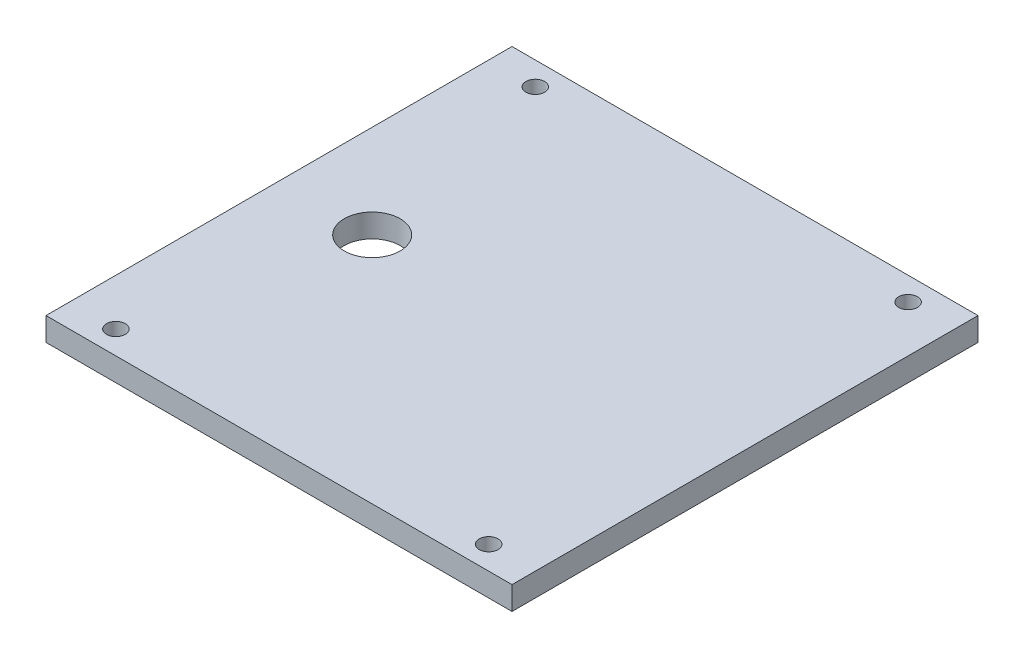
ISO-10303-21;
HEADER;
FILE_DESCRIPTION(('STEP AP214'),'2;1');
FILE_NAME('part.step','',(''),(''),'','','');
FILE_SCHEMA(('AUTOMOTIVE_DESIGN { 1 0 10303 214 1 1 1 1 }'));
ENDSEC;
DATA;
#1=APPLICATION_CONTEXT('core data for automotive mechanical design processes');
#2=APPLICATION_PROTOCOL_DEFINITION('international standard','automotive_design',2000,#1);
#3=PRODUCT_CONTEXT('',#1,'mechanical');
#4=PRODUCT('Part','Part','',(#3));
#5=PRODUCT_RELATED_PRODUCT_CATEGORY('part','',(#4));
#6=PRODUCT_DEFINITION_FORMATION('','',#4);
#7=PRODUCT_DEFINITION_CONTEXT('part definition',#1,'design');
#8=PRODUCT_DEFINITION('design','',#6,#7);
#9=PRODUCT_DEFINITION_SHAPE('','',#8);
#10=(LENGTH_UNIT() NAMED_UNIT(*) SI_UNIT(.MILLI.,.METRE.));
#11=(NAMED_UNIT(*) PLANE_ANGLE_UNIT() SI_UNIT($,.RADIAN.));
#12=(NAMED_UNIT(*) SI_UNIT($,.STERADIAN.) SOLID_ANGLE_UNIT());
#13=UNCERTAINTY_MEASURE_WITH_UNIT(LENGTH_MEASURE(1.E-05),#10,'distance_accuracy_value','');
#14=(GEOMETRIC_REPRESENTATION_CONTEXT(3) GLOBAL_UNCERTAINTY_ASSIGNED_CONTEXT((#13)) GLOBAL_UNIT_ASSIGNED_CONTEXT((#10,
#11,#12)) REPRESENTATION_CONTEXT('',''));
#15=CARTESIAN_POINT('',(0.,0.,0.));
#16=DIRECTION('',(0.,0.,1.));
#17=DIRECTION('',(1.,0.,0.));
#18=AXIS2_PLACEMENT_3D('',#15,#16,#17);
#19=CARTESIAN_POINT('',(61.6285196606894,6.35,63.5));
#20=DIRECTION('',(-1.,0.,0.));
#21=DIRECTION('',(0.,0.,1.));
#22=AXIS2_PLACEMENT_3D('',#19,#20,#21);
#23=PLANE('',#22);
#24=DIRECTION('',(0.,0.,-1.));
#25=VECTOR('',#24,1.);
#26=CARTESIAN_POINT('',(61.6285196606894,0.,63.5));
#27=LINE('',#26,#25);
#28=CARTESIAN_POINT('',(61.6285196606894,0.,63.5));
#29=VERTEX_POINT('',#28);
#30=CARTESIAN_POINT('',(61.6285196606894,0.,-63.5));
#31=VERTEX_POINT('',#30);
#32=EDGE_CURVE('E114',#29,#31,#27,.T.);
#33=ORIENTED_EDGE('',*,*,#32,.T.);
#34=DIRECTION('',(0.,-1.,0.));
#35=VECTOR('',#34,1.);
#36=CARTESIAN_POINT('',(61.6285196606894,6.35,-63.5));
#37=LINE('',#36,#35);
#38=CARTESIAN_POINT('',(61.6285196606894,6.35,-63.5));
#39=VERTEX_POINT('',#38);
#40=EDGE_CURVE('E11',#39,#31,#37,.T.);
#41=ORIENTED_EDGE('',*,*,#40,.F.);
#42=DIRECTION('',(0.,0.,-1.));
#43=VECTOR('',#42,1.);
#44=CARTESIAN_POINT('',(61.6285196606894,6.35,63.5));
#45=LINE('',#44,#43);
#46=CARTESIAN_POINT('',(61.6285196606894,6.35,63.5));
#47=VERTEX_POINT('',#46);
#48=EDGE_CURVE('E97',#47,#39,#45,.T.);
#49=ORIENTED_EDGE('',*,*,#48,.F.);
#50=DIRECTION('',(0.,-1.,0.));
#51=VECTOR('',#50,1.);
#52=CARTESIAN_POINT('',(61.6285196606894,6.35,63.5));
#53=LINE('',#52,#51);
#54=EDGE_CURVE('E110',#47,#29,#53,.T.);
#55=ORIENTED_EDGE('',*,*,#54,.T.);
#56=EDGE_LOOP('',(#33,#41,#49,#55));
#57=FACE_BOUND('',#56,.T.);
#58=ADVANCED_FACE('F43',(#57),#23,.F.);
#59=CARTESIAN_POINT('',(-65.3714803393106,6.35,-63.5));
#60=DIRECTION('',(0.,0.,1.));
#61=DIRECTION('',(1.,0.,0.));
#62=AXIS2_PLACEMENT_3D('',#59,#60,#61);
#63=PLANE('',#62);
#64=DIRECTION('',(-1.,0.,0.));
#65=VECTOR('',#64,1.);
#66=CARTESIAN_POINT('',(-65.3714803393106,0.,-63.5));
#67=LINE('',#66,#65);
#68=CARTESIAN_POINT('',(-65.3714803393106,0.,-63.5));
#69=VERTEX_POINT('',#68);
#70=EDGE_CURVE('E102',#31,#69,#67,.T.);
#71=ORIENTED_EDGE('',*,*,#70,.T.);
#72=DIRECTION('',(0.,-1.,0.));
#73=VECTOR('',#72,1.);
#74=CARTESIAN_POINT('',(-65.3714803393106,6.35,-63.5));
#75=LINE('',#74,#73);
#76=CARTESIAN_POINT('',(-65.3714803393106,6.35,-63.5));
#77=VERTEX_POINT('',#76);
#78=EDGE_CURVE('E53',#77,#69,#75,.T.);
#79=ORIENTED_EDGE('',*,*,#78,.F.);
#80=DIRECTION('',(-1.,0.,0.));
#81=VECTOR('',#80,1.);
#82=CARTESIAN_POINT('',(-65.3714803393106,6.35,-63.5));
#83=LINE('',#82,#81);
#84=EDGE_CURVE('E92',#39,#77,#83,.T.);
#85=ORIENTED_EDGE('',*,*,#84,.F.);
#86=ORIENTED_EDGE('',*,*,#40,.T.);
#87=EDGE_LOOP('',(#71,#79,#85,#86));
#88=FACE_BOUND('',#87,.T.);
#89=ADVANCED_FACE('F101',(#88),#63,.F.);
#90=CARTESIAN_POINT('',(-65.3714803393106,6.35,63.5));
#91=DIRECTION('',(1.,0.,0.));
#92=DIRECTION('',(0.,0.,-1.));
#93=AXIS2_PLACEMENT_3D('',#90,#91,#92);
#94=PLANE('',#93);
#95=DIRECTION('',(0.,0.,1.));
#96=VECTOR('',#95,1.);
#97=CARTESIAN_POINT('',(-65.3714803393106,0.,63.5));
#98=LINE('',#97,#96);
#99=CARTESIAN_POINT('',(-65.3714803393106,0.,63.5));
#100=VERTEX_POINT('',#99);
#101=EDGE_CURVE('E79',#69,#100,#98,.T.);
#102=ORIENTED_EDGE('',*,*,#101,.T.);
#103=DIRECTION('',(0.,-1.,0.));
#104=VECTOR('',#103,1.);
#105=CARTESIAN_POINT('',(-65.3714803393106,6.35,63.5));
#106=LINE('',#105,#104);
#107=CARTESIAN_POINT('',(-65.3714803393106,6.35,63.5));
#108=VERTEX_POINT('',#107);
#109=EDGE_CURVE('E104',#108,#100,#106,.T.);
#110=ORIENTED_EDGE('',*,*,#109,.F.);
#111=DIRECTION('',(0.,0.,1.));
#112=VECTOR('',#111,1.);
#113=CARTESIAN_POINT('',(-65.3714803393106,6.35,63.5));
#114=LINE('',#113,#112);
#115=EDGE_CURVE('E95',#77,#108,#114,.T.);
#116=ORIENTED_EDGE('',*,*,#115,.F.);
#117=ORIENTED_EDGE('',*,*,#78,.T.);
#118=EDGE_LOOP('',(#102,#110,#116,#117));
#119=FACE_BOUND('',#118,.T.);
#120=ADVANCED_FACE('F106',(#119),#94,.F.);
#121=CARTESIAN_POINT('',(-65.3714803393106,6.35,63.5));
#122=DIRECTION('',(0.,0.,-1.));
#123=DIRECTION('',(-1.,0.,0.));
#124=AXIS2_PLACEMENT_3D('',#121,#122,#123);
#125=PLANE('',#124);
#126=DIRECTION('',(1.,0.,0.));
#127=VECTOR('',#126,1.);
#128=CARTESIAN_POINT('',(-65.3714803393106,0.,63.5));
#129=LINE('',#128,#127);
#130=EDGE_CURVE('E85',#100,#29,#129,.T.);
#131=ORIENTED_EDGE('',*,*,#130,.T.);
#132=ORIENTED_EDGE('',*,*,#54,.F.);
#133=DIRECTION('',(1.,0.,0.));
#134=VECTOR('',#133,1.);
#135=CARTESIAN_POINT('',(-65.3714803393106,6.35,63.5));
#136=LINE('',#135,#134);
#137=EDGE_CURVE('E62',#108,#47,#136,.T.);
#138=ORIENTED_EDGE('',*,*,#137,.F.);
#139=ORIENTED_EDGE('',*,*,#109,.T.);
#140=EDGE_LOOP('',(#131,#132,#138,#139));
#141=FACE_BOUND('',#140,.T.);
#142=ADVANCED_FACE('F161',(#141),#125,.F.);
#143=CARTESIAN_POINT('',(0.,6.35,0.));
#144=DIRECTION('',(0.,-1.,0.));
#145=DIRECTION('',(0.,0.,-1.));
#146=AXIS2_PLACEMENT_3D('',#143,#144,#145);
#147=PLANE('',#146);
#148=CARTESIAN_POINT('',(-39.9714803393106,6.35,0.));
#149=DIRECTION('',(0.,1.,0.));
#150=DIRECTION('',(0.,0.,1.));
#151=AXIS2_PLACEMENT_3D('',#148,#149,#150);
#152=CIRCLE('',#151,7.62);
#153=CARTESIAN_POINT('',(-39.9714803393106,6.35,7.62000000000002));
#154=VERTEX_POINT('',#153);
#155=EDGE_CURVE('E281',#154,#154,#152,.T.);
#156=ORIENTED_EDGE('',*,*,#155,.F.);
#157=EDGE_LOOP('',(#156));
#158=FACE_BOUND('',#157,.T.);
#159=CARTESIAN_POINT('',(48.9285196606894,6.35,-57.15));
#160=DIRECTION('',(0.,1.,0.));
#161=DIRECTION('',(0.,0.,-1.));
#162=AXIS2_PLACEMENT_3D('',#159,#160,#161);
#163=CIRCLE('',#162,2.5527);
#164=CARTESIAN_POINT('',(48.9285196606894,6.35,-54.5973));
#165=VERTEX_POINT('',#164);
#166=EDGE_CURVE('E283',#165,#165,#163,.T.);
#167=ORIENTED_EDGE('',*,*,#166,.F.);
#168=EDGE_LOOP('',(#167));
#169=FACE_BOUND('',#168,.T.);
#170=CARTESIAN_POINT('',(48.9285196606894,6.35,57.15));
#171=DIRECTION('',(0.,1.,0.));
#172=DIRECTION('',(0.,0.,1.));
#173=AXIS2_PLACEMENT_3D('',#170,#171,#172);
#174=CIRCLE('',#173,2.5527);
#175=CARTESIAN_POINT('',(48.9285196606894,6.35,59.7027));
#176=VERTEX_POINT('',#175);
#177=EDGE_CURVE('E288',#176,#176,#174,.T.);
#178=ORIENTED_EDGE('',*,*,#177,.F.);
#179=EDGE_LOOP('',(#178));
#180=FACE_BOUND('',#179,.T.);
#181=CARTESIAN_POINT('',(-52.6714803393106,6.35,57.15));
#182=DIRECTION('',(0.,1.,0.));
#183=DIRECTION('',(0.,0.,-1.));
#184=AXIS2_PLACEMENT_3D('',#181,#182,#183);
#185=CIRCLE('',#184,2.5527);
#186=CARTESIAN_POINT('',(-52.6714803393106,6.35,59.7027));
#187=VERTEX_POINT('',#186);
#188=EDGE_CURVE('E292',#187,#187,#185,.T.);
#189=ORIENTED_EDGE('',*,*,#188,.F.);
#190=EDGE_LOOP('',(#189));
#191=FACE_BOUND('',#190,.T.);
#192=CARTESIAN_POINT('',(-52.6714803393106,6.35,-57.15));
#193=DIRECTION('',(0.,1.,0.));
#194=DIRECTION('',(0.,0.,1.));
#195=AXIS2_PLACEMENT_3D('',#192,#193,#194);
#196=CIRCLE('',#195,2.5527);
#197=CARTESIAN_POINT('',(-52.6714803393106,6.35,-54.5973));
#198=VERTEX_POINT('',#197);
#199=EDGE_CURVE('E133',#198,#198,#196,.T.);
#200=ORIENTED_EDGE('',*,*,#199,.F.);
#201=EDGE_LOOP('',(#200));
#202=FACE_BOUND('',#201,.T.);
#203=ORIENTED_EDGE('',*,*,#48,.T.);
#204=ORIENTED_EDGE('',*,*,#84,.T.);
#205=ORIENTED_EDGE('',*,*,#115,.T.);
#206=ORIENTED_EDGE('',*,*,#137,.T.);
#207=EDGE_LOOP('',(#203,#204,#205,#206));
#208=FACE_BOUND('',#207,.T.);
#209=ADVANCED_FACE('F93',(#158,#169,#180,#191,#202,#208),#147,.F.);
#210=CARTESIAN_POINT('',(0.,0.,0.));
#211=DIRECTION('',(0.,-1.,0.));
#212=DIRECTION('',(0.,0.,-1.));
#213=AXIS2_PLACEMENT_3D('',#210,#211,#212);
#214=PLANE('',#213);
#215=CARTESIAN_POINT('',(-39.9714803393106,0.,0.));
#216=DIRECTION('',(0.,-1.,0.));
#217=DIRECTION('',(0.,0.,-1.));
#218=AXIS2_PLACEMENT_3D('',#215,#216,#217);
#219=CIRCLE('',#218,7.62);
#220=CARTESIAN_POINT('',(-39.9714803393106,0.,-7.61999999999999));
#221=VERTEX_POINT('',#220);
#222=EDGE_CURVE('E278',#221,#221,#219,.F.);
#223=ORIENTED_EDGE('',*,*,#222,.T.);
#224=EDGE_LOOP('',(#223));
#225=FACE_BOUND('',#224,.T.);
#226=CARTESIAN_POINT('',(48.9285196606894,0.,-57.15));
#227=DIRECTION('',(0.,-1.,0.));
#228=DIRECTION('',(0.,0.,-1.));
#229=AXIS2_PLACEMENT_3D('',#226,#227,#228);
#230=CIRCLE('',#229,2.5527);
#231=CARTESIAN_POINT('',(48.9285196606894,0.,-54.5973));
#232=VERTEX_POINT('',#231);
#233=EDGE_CURVE('E46',#232,#232,#230,.T.);
#234=ORIENTED_EDGE('',*,*,#233,.F.);
#235=EDGE_LOOP('',(#234));
#236=FACE_BOUND('',#235,.T.);
#237=CARTESIAN_POINT('',(48.9285196606894,0.,57.15));
#238=DIRECTION('',(0.,-1.,0.));
#239=DIRECTION('',(0.,0.,-1.));
#240=AXIS2_PLACEMENT_3D('',#237,#238,#239);
#241=CIRCLE('',#240,2.5527);
#242=CARTESIAN_POINT('',(48.9285196606894,0.,59.7027));
#243=VERTEX_POINT('',#242);
#244=EDGE_CURVE('E136',#243,#243,#241,.T.);
#245=ORIENTED_EDGE('',*,*,#244,.F.);
#246=EDGE_LOOP('',(#245));
#247=FACE_BOUND('',#246,.T.);
#248=CARTESIAN_POINT('',(-52.6714803393106,0.,57.15));
#249=DIRECTION('',(0.,-1.,0.));
#250=DIRECTION('',(0.,0.,-1.));
#251=AXIS2_PLACEMENT_3D('',#248,#249,#250);
#252=CIRCLE('',#251,2.5527);
#253=CARTESIAN_POINT('',(-52.6714803393106,0.,59.7027));
#254=VERTEX_POINT('',#253);
#255=EDGE_CURVE('E132',#254,#254,#252,.T.);
#256=ORIENTED_EDGE('',*,*,#255,.F.);
#257=EDGE_LOOP('',(#256));
#258=FACE_BOUND('',#257,.T.);
#259=CARTESIAN_POINT('',(-52.6714803393106,0.,-57.15));
#260=DIRECTION('',(0.,-1.,0.));
#261=DIRECTION('',(0.,0.,-1.));
#262=AXIS2_PLACEMENT_3D('',#259,#260,#261);
#263=CIRCLE('',#262,2.5527);
#264=CARTESIAN_POINT('',(-52.6714803393106,0.,-54.5973));
#265=VERTEX_POINT('',#264);
#266=EDGE_CURVE('E128',#265,#265,#263,.T.);
#267=ORIENTED_EDGE('',*,*,#266,.F.);
#268=EDGE_LOOP('',(#267));
#269=FACE_BOUND('',#268,.T.);
#270=ORIENTED_EDGE('',*,*,#32,.F.);
#271=ORIENTED_EDGE('',*,*,#130,.F.);
#272=ORIENTED_EDGE('',*,*,#101,.F.);
#273=ORIENTED_EDGE('',*,*,#70,.F.);
#274=EDGE_LOOP('',(#270,#271,#272,#273));
#275=FACE_BOUND('',#274,.T.);
#276=ADVANCED_FACE('F148',(#225,#236,#247,#258,#269,#275),#214,.T.);
#277=CARTESIAN_POINT('',(-52.6714803393106,-3.175,-57.15));
#278=DIRECTION('',(0.,1.,0.));
#279=DIRECTION('',(0.,0.,1.));
#280=AXIS2_PLACEMENT_3D('',#277,#278,#279);
#281=CYLINDRICAL_SURFACE('',#280,2.5527);
#282=CARTESIAN_POINT('',(-52.6714803393106,0.,-54.5973));
#283=CARTESIAN_POINT('',(-52.6714803393106,0.0661458333333336,-54.5973));
#284=CARTESIAN_POINT('',(-52.6714803393106,0.132291666666667,-54.5973));
#285=CARTESIAN_POINT('',(-52.6714803393106,0.264583333333334,-54.5973));
#286=CARTESIAN_POINT('',(-52.6714803393106,0.330729166666667,-54.5973));
#287=CARTESIAN_POINT('',(-52.6714803393106,0.463020833333334,-54.5973));
#288=CARTESIAN_POINT('',(-52.6714803393106,0.529166666666667,-54.5973));
#289=CARTESIAN_POINT('',(-52.6714803393106,0.661458333333334,-54.5973));
#290=CARTESIAN_POINT('',(-52.6714803393106,0.727604166666667,-54.5973));
#291=CARTESIAN_POINT('',(-52.6714803393106,0.859895833333333,-54.5973));
#292=CARTESIAN_POINT('',(-52.6714803393106,0.926041666666667,-54.5973));
#293=CARTESIAN_POINT('',(-52.6714803393106,1.05833333333333,-54.5973));
#294=CARTESIAN_POINT('',(-52.6714803393106,1.12447916666667,-54.5973));
#295=CARTESIAN_POINT('',(-52.6714803393106,1.25677083333333,-54.5973));
#296=CARTESIAN_POINT('',(-52.6714803393106,1.32291666666667,-54.5973));
#297=CARTESIAN_POINT('',(-52.6714803393106,1.45520833333333,-54.5973));
#298=CARTESIAN_POINT('',(-52.6714803393106,1.52135416666667,-54.5973));
#299=CARTESIAN_POINT('',(-52.6714803393106,1.65364583333333,-54.5973));
#300=CARTESIAN_POINT('',(-52.6714803393106,1.71979166666667,-54.5973));
#301=CARTESIAN_POINT('',(-52.6714803393106,1.85208333333333,-54.5973));
#302=CARTESIAN_POINT('',(-52.6714803393106,1.91822916666667,-54.5973));
#303=CARTESIAN_POINT('',(-52.6714803393106,2.05052083333333,-54.5973));
#304=CARTESIAN_POINT('',(-52.6714803393106,2.11666666666667,-54.5973));
#305=CARTESIAN_POINT('',(-52.6714803393106,2.24895833333333,-54.5973));
#306=CARTESIAN_POINT('',(-52.6714803393106,2.31510416666667,-54.5973));
#307=CARTESIAN_POINT('',(-52.6714803393106,2.44739583333333,-54.5973));
#308=CARTESIAN_POINT('',(-52.6714803393106,2.51354166666667,-54.5973));
#309=CARTESIAN_POINT('',(-52.6714803393106,2.64583333333333,-54.5973));
#310=CARTESIAN_POINT('',(-52.6714803393106,2.71197916666667,-54.5973));
#311=CARTESIAN_POINT('',(-52.6714803393106,2.84427083333333,-54.5973));
#312=CARTESIAN_POINT('',(-52.6714803393106,2.91041666666667,-54.5973));
#313=CARTESIAN_POINT('',(-52.6714803393106,3.04270833333333,-54.5973));
#314=CARTESIAN_POINT('',(-52.6714803393106,3.10885416666667,-54.5973));
#315=CARTESIAN_POINT('',(-52.6714803393106,3.24114583333333,-54.5973));
#316=CARTESIAN_POINT('',(-52.6714803393106,3.30729166666667,-54.5973));
#317=CARTESIAN_POINT('',(-52.6714803393106,3.43958333333333,-54.5973));
#318=CARTESIAN_POINT('',(-52.6714803393106,3.50572916666667,-54.5973));
#319=CARTESIAN_POINT('',(-52.6714803393106,3.63802083333333,-54.5973));
#320=CARTESIAN_POINT('',(-52.6714803393106,3.70416666666667,-54.5973));
#321=CARTESIAN_POINT('',(-52.6714803393106,3.83645833333333,-54.5973));
#322=CARTESIAN_POINT('',(-52.6714803393106,3.90260416666667,-54.5973));
#323=CARTESIAN_POINT('',(-52.6714803393106,4.03489583333333,-54.5973));
#324=CARTESIAN_POINT('',(-52.6714803393106,4.10104166666667,-54.5973));
#325=CARTESIAN_POINT('',(-52.6714803393106,4.23333333333333,-54.5973));
#326=CARTESIAN_POINT('',(-52.6714803393106,4.29947916666667,-54.5973));
#327=CARTESIAN_POINT('',(-52.6714803393106,4.43177083333333,-54.5973));
#328=CARTESIAN_POINT('',(-52.6714803393106,4.49791666666667,-54.5973));
#329=CARTESIAN_POINT('',(-52.6714803393106,4.63020833333333,-54.5973));
#330=CARTESIAN_POINT('',(-52.6714803393106,4.69635416666667,-54.5973));
#331=CARTESIAN_POINT('',(-52.6714803393106,4.82864583333333,-54.5973));
#332=CARTESIAN_POINT('',(-52.6714803393106,4.89479166666667,-54.5973));
#333=CARTESIAN_POINT('',(-52.6714803393106,5.02708333333333,-54.5973));
#334=CARTESIAN_POINT('',(-52.6714803393106,5.09322916666667,-54.5973));
#335=CARTESIAN_POINT('',(-52.6714803393106,5.22552083333333,-54.5973));
#336=CARTESIAN_POINT('',(-52.6714803393106,5.29166666666667,-54.5973));
#337=CARTESIAN_POINT('',(-52.6714803393106,5.42395833333333,-54.5973));
#338=CARTESIAN_POINT('',(-52.6714803393106,5.49010416666667,-54.5973));
#339=CARTESIAN_POINT('',(-52.6714803393106,5.62239583333333,-54.5973));
#340=CARTESIAN_POINT('',(-52.6714803393106,5.68854166666667,-54.5973));
#341=CARTESIAN_POINT('',(-52.6714803393106,5.82083333333333,-54.5973));
#342=CARTESIAN_POINT('',(-52.6714803393106,5.88697916666667,-54.5973));
#343=CARTESIAN_POINT('',(-52.6714803393106,6.01927083333333,-54.5973));
#344=CARTESIAN_POINT('',(-52.6714803393106,6.08541666666667,-54.5973));
#345=CARTESIAN_POINT('',(-52.6714803393106,6.21770833333333,-54.5973));
#346=CARTESIAN_POINT('',(-52.6714803393106,6.28385416666667,-54.5973));
#347=CARTESIAN_POINT('',(-52.6714803393106,6.35,-54.5973));
#348=B_SPLINE_CURVE_WITH_KNOTS('',3,(#282,#283,#284,#285,#286,#287,#288,#289,#290,#291,#292,
#293,#294,#295,#296,#297,#298,#299,#300,#301,#302,#303,#304,#305,#306,#307,#308,#309,#310,#311,
#312,#313,#314,#315,#316,#317,#318,#319,#320,#321,#322,#323,#324,#325,#326,#327,#328,#329,#330,
#331,#332,#333,#334,#335,#336,#337,#338,#339,#340,#341,#342,#343,#344,#345,#346,#347),
.UNSPECIFIED.,.F.,.F.,(4,2,2,2,2,2,2,2,2,2,2,2,2,2,2,2,2,2,2,2,2,2,2,2,2,2,2,2,2,2,2,2,4),(0.,
0.1984375,0.396875,0.5953125,0.79375,0.9921875,1.190625,1.3890625,1.5875,1.7859375,1.984375,
2.1828125,2.38125,2.5796875,2.778125,2.9765625,3.175,3.3734375,3.571875,3.7703125,3.96875,
4.1671875,4.365625,4.5640625,4.7625,4.9609375,5.159375,5.3578125,5.55625,5.7546875,5.953125,
6.1515625,6.35),.UNSPECIFIED.);
#349=EDGE_CURVE('BSEAM151',#265,#198,#348,.T.);
#350=ORIENTED_EDGE('',*,*,#266,.T.);
#351=ORIENTED_EDGE('',*,*,#199,.T.);
#352=ORIENTED_EDGE('',*,*,#349,.T.);
#353=ORIENTED_EDGE('',*,*,#349,.F.);
#354=EDGE_LOOP('',(#350,#352,#351,#353));
#355=FACE_BOUND('',#354,.T.);
#356=ADVANCED_FACE('F151',(#355),#281,.F.);
#357=CARTESIAN_POINT('',(-52.6714803393106,-3.175,57.15));
#358=DIRECTION('',(0.,1.,0.));
#359=DIRECTION('',(0.,0.,1.));
#360=AXIS2_PLACEMENT_3D('',#357,#358,#359);
#361=CYLINDRICAL_SURFACE('',#360,2.5527);
#362=CARTESIAN_POINT('',(-52.6714803393106,0.,59.7027));
#363=CARTESIAN_POINT('',(-52.6714803393106,0.0661458333333336,59.7027));
#364=CARTESIAN_POINT('',(-52.6714803393106,0.132291666666667,59.7027));
#365=CARTESIAN_POINT('',(-52.6714803393106,0.264583333333334,59.7027));
#366=CARTESIAN_POINT('',(-52.6714803393106,0.330729166666667,59.7027));
#367=CARTESIAN_POINT('',(-52.6714803393106,0.463020833333334,59.7027));
#368=CARTESIAN_POINT('',(-52.6714803393106,0.529166666666667,59.7027));
#369=CARTESIAN_POINT('',(-52.6714803393106,0.661458333333334,59.7027));
#370=CARTESIAN_POINT('',(-52.6714803393106,0.727604166666667,59.7027));
#371=CARTESIAN_POINT('',(-52.6714803393106,0.859895833333333,59.7027));
#372=CARTESIAN_POINT('',(-52.6714803393106,0.926041666666667,59.7027));
#373=CARTESIAN_POINT('',(-52.6714803393106,1.05833333333333,59.7027));
#374=CARTESIAN_POINT('',(-52.6714803393106,1.12447916666667,59.7027));
#375=CARTESIAN_POINT('',(-52.6714803393106,1.25677083333333,59.7027));
#376=CARTESIAN_POINT('',(-52.6714803393106,1.32291666666667,59.7027));
#377=CARTESIAN_POINT('',(-52.6714803393106,1.45520833333333,59.7027));
#378=CARTESIAN_POINT('',(-52.6714803393106,1.52135416666667,59.7027));
#379=CARTESIAN_POINT('',(-52.6714803393106,1.65364583333333,59.7027));
#380=CARTESIAN_POINT('',(-52.6714803393106,1.71979166666667,59.7027));
#381=CARTESIAN_POINT('',(-52.6714803393106,1.85208333333333,59.7027));
#382=CARTESIAN_POINT('',(-52.6714803393106,1.91822916666667,59.7027));
#383=CARTESIAN_POINT('',(-52.6714803393106,2.05052083333333,59.7027));
#384=CARTESIAN_POINT('',(-52.6714803393106,2.11666666666667,59.7027));
#385=CARTESIAN_POINT('',(-52.6714803393106,2.24895833333333,59.7027));
#386=CARTESIAN_POINT('',(-52.6714803393106,2.31510416666667,59.7027));
#387=CARTESIAN_POINT('',(-52.6714803393106,2.44739583333333,59.7027));
#388=CARTESIAN_POINT('',(-52.6714803393106,2.51354166666667,59.7027));
#389=CARTESIAN_POINT('',(-52.6714803393106,2.64583333333333,59.7027));
#390=CARTESIAN_POINT('',(-52.6714803393106,2.71197916666667,59.7027));
#391=CARTESIAN_POINT('',(-52.6714803393106,2.84427083333333,59.7027));
#392=CARTESIAN_POINT('',(-52.6714803393106,2.91041666666667,59.7027));
#393=CARTESIAN_POINT('',(-52.6714803393106,3.04270833333333,59.7027));
#394=CARTESIAN_POINT('',(-52.6714803393106,3.10885416666667,59.7027));
#395=CARTESIAN_POINT('',(-52.6714803393106,3.24114583333333,59.7027));
#396=CARTESIAN_POINT('',(-52.6714803393106,3.30729166666667,59.7027));
#397=CARTESIAN_POINT('',(-52.6714803393106,3.43958333333333,59.7027));
#398=CARTESIAN_POINT('',(-52.6714803393106,3.50572916666667,59.7027));
#399=CARTESIAN_POINT('',(-52.6714803393106,3.63802083333333,59.7027));
#400=CARTESIAN_POINT('',(-52.6714803393106,3.70416666666667,59.7027));
#401=CARTESIAN_POINT('',(-52.6714803393106,3.83645833333333,59.7027));
#402=CARTESIAN_POINT('',(-52.6714803393106,3.90260416666667,59.7027));
#403=CARTESIAN_POINT('',(-52.6714803393106,4.03489583333333,59.7027));
#404=CARTESIAN_POINT('',(-52.6714803393106,4.10104166666667,59.7027));
#405=CARTESIAN_POINT('',(-52.6714803393106,4.23333333333333,59.7027));
#406=CARTESIAN_POINT('',(-52.6714803393106,4.29947916666667,59.7027));
#407=CARTESIAN_POINT('',(-52.6714803393106,4.43177083333333,59.7027));
#408=CARTESIAN_POINT('',(-52.6714803393106,4.49791666666667,59.7027));
#409=CARTESIAN_POINT('',(-52.6714803393106,4.63020833333333,59.7027));
#410=CARTESIAN_POINT('',(-52.6714803393106,4.69635416666667,59.7027));
#411=CARTESIAN_POINT('',(-52.6714803393106,4.82864583333333,59.7027));
#412=CARTESIAN_POINT('',(-52.6714803393106,4.89479166666667,59.7027));
#413=CARTESIAN_POINT('',(-52.6714803393106,5.02708333333333,59.7027));
#414=CARTESIAN_POINT('',(-52.6714803393106,5.09322916666667,59.7027));
#415=CARTESIAN_POINT('',(-52.6714803393106,5.22552083333333,59.7027));
#416=CARTESIAN_POINT('',(-52.6714803393106,5.29166666666667,59.7027));
#417=CARTESIAN_POINT('',(-52.6714803393106,5.42395833333333,59.7027));
#418=CARTESIAN_POINT('',(-52.6714803393106,5.49010416666667,59.7027));
#419=CARTESIAN_POINT('',(-52.6714803393106,5.62239583333333,59.7027));
#420=CARTESIAN_POINT('',(-52.6714803393106,5.68854166666667,59.7027));
#421=CARTESIAN_POINT('',(-52.6714803393106,5.82083333333333,59.7027));
#422=CARTESIAN_POINT('',(-52.6714803393106,5.88697916666667,59.7027));
#423=CARTESIAN_POINT('',(-52.6714803393106,6.01927083333333,59.7027));
#424=CARTESIAN_POINT('',(-52.6714803393106,6.08541666666667,59.7027));
#425=CARTESIAN_POINT('',(-52.6714803393106,6.21770833333333,59.7027));
#426=CARTESIAN_POINT('',(-52.6714803393106,6.28385416666667,59.7027));
#427=CARTESIAN_POINT('',(-52.6714803393106,6.35,59.7027));
#428=B_SPLINE_CURVE_WITH_KNOTS('',3,(#362,#363,#364,#365,#366,#367,#368,#369,#370,#371,#372,
#373,#374,#375,#376,#377,#378,#379,#380,#381,#382,#383,#384,#385,#386,#387,#388,#389,#390,#391,
#392,#393,#394,#395,#396,#397,#398,#399,#400,#401,#402,#403,#404,#405,#406,#407,#408,#409,#410,
#411,#412,#413,#414,#415,#416,#417,#418,#419,#420,#421,#422,#423,#424,#425,#426,#427),
.UNSPECIFIED.,.F.,.F.,(4,2,2,2,2,2,2,2,2,2,2,2,2,2,2,2,2,2,2,2,2,2,2,2,2,2,2,2,2,2,2,2,4),(0.,
0.1984375,0.396875,0.5953125,0.79375,0.9921875,1.190625,1.3890625,1.5875,1.7859375,1.984375,
2.1828125,2.38125,2.5796875,2.778125,2.9765625,3.175,3.3734375,3.571875,3.7703125,3.96875,
4.1671875,4.365625,4.5640625,4.7625,4.9609375,5.159375,5.3578125,5.55625,5.7546875,5.953125,
6.1515625,6.35),.UNSPECIFIED.);
#429=EDGE_CURVE('BSEAM197',#254,#187,#428,.T.);
#430=ORIENTED_EDGE('',*,*,#255,.T.);
#431=ORIENTED_EDGE('',*,*,#188,.T.);
#432=ORIENTED_EDGE('',*,*,#429,.T.);
#433=ORIENTED_EDGE('',*,*,#429,.F.);
#434=EDGE_LOOP('',(#430,#432,#431,#433));
#435=FACE_BOUND('',#434,.T.);
#436=ADVANCED_FACE('F197',(#435),#361,.F.);
#437=CARTESIAN_POINT('',(48.9285196606894,-3.175,57.15));
#438=DIRECTION('',(0.,1.,0.));
#439=DIRECTION('',(0.,0.,1.));
#440=AXIS2_PLACEMENT_3D('',#437,#438,#439);
#441=CYLINDRICAL_SURFACE('',#440,2.5527);
#442=CARTESIAN_POINT('',(48.9285196606894,0.,59.7027));
#443=CARTESIAN_POINT('',(48.9285196606894,0.0661458333333336,59.7027));
#444=CARTESIAN_POINT('',(48.9285196606894,0.132291666666667,59.7027));
#445=CARTESIAN_POINT('',(48.9285196606894,0.264583333333334,59.7027));
#446=CARTESIAN_POINT('',(48.9285196606894,0.330729166666667,59.7027));
#447=CARTESIAN_POINT('',(48.9285196606894,0.463020833333334,59.7027));
#448=CARTESIAN_POINT('',(48.9285196606894,0.529166666666667,59.7027));
#449=CARTESIAN_POINT('',(48.9285196606894,0.661458333333334,59.7027));
#450=CARTESIAN_POINT('',(48.9285196606894,0.727604166666667,59.7027));
#451=CARTESIAN_POINT('',(48.9285196606894,0.859895833333333,59.7027));
#452=CARTESIAN_POINT('',(48.9285196606894,0.926041666666667,59.7027));
#453=CARTESIAN_POINT('',(48.9285196606894,1.05833333333333,59.7027));
#454=CARTESIAN_POINT('',(48.9285196606894,1.12447916666667,59.7027));
#455=CARTESIAN_POINT('',(48.9285196606894,1.25677083333333,59.7027));
#456=CARTESIAN_POINT('',(48.9285196606894,1.32291666666667,59.7027));
#457=CARTESIAN_POINT('',(48.9285196606894,1.45520833333333,59.7027));
#458=CARTESIAN_POINT('',(48.9285196606894,1.52135416666667,59.7027));
#459=CARTESIAN_POINT('',(48.9285196606894,1.65364583333333,59.7027));
#460=CARTESIAN_POINT('',(48.9285196606894,1.71979166666667,59.7027));
#461=CARTESIAN_POINT('',(48.9285196606894,1.85208333333333,59.7027));
#462=CARTESIAN_POINT('',(48.9285196606894,1.91822916666667,59.7027));
#463=CARTESIAN_POINT('',(48.9285196606894,2.05052083333333,59.7027));
#464=CARTESIAN_POINT('',(48.9285196606894,2.11666666666667,59.7027));
#465=CARTESIAN_POINT('',(48.9285196606894,2.24895833333333,59.7027));
#466=CARTESIAN_POINT('',(48.9285196606894,2.31510416666667,59.7027));
#467=CARTESIAN_POINT('',(48.9285196606894,2.44739583333333,59.7027));
#468=CARTESIAN_POINT('',(48.9285196606894,2.51354166666667,59.7027));
#469=CARTESIAN_POINT('',(48.9285196606894,2.64583333333333,59.7027));
#470=CARTESIAN_POINT('',(48.9285196606894,2.71197916666667,59.7027));
#471=CARTESIAN_POINT('',(48.9285196606894,2.84427083333333,59.7027));
#472=CARTESIAN_POINT('',(48.9285196606894,2.91041666666667,59.7027));
#473=CARTESIAN_POINT('',(48.9285196606894,3.04270833333333,59.7027));
#474=CARTESIAN_POINT('',(48.9285196606894,3.10885416666667,59.7027));
#475=CARTESIAN_POINT('',(48.9285196606894,3.24114583333333,59.7027));
#476=CARTESIAN_POINT('',(48.9285196606894,3.30729166666667,59.7027));
#477=CARTESIAN_POINT('',(48.9285196606894,3.43958333333333,59.7027));
#478=CARTESIAN_POINT('',(48.9285196606894,3.50572916666667,59.7027));
#479=CARTESIAN_POINT('',(48.9285196606894,3.63802083333333,59.7027));
#480=CARTESIAN_POINT('',(48.9285196606894,3.70416666666667,59.7027));
#481=CARTESIAN_POINT('',(48.9285196606894,3.83645833333333,59.7027));
#482=CARTESIAN_POINT('',(48.9285196606894,3.90260416666667,59.7027));
#483=CARTESIAN_POINT('',(48.9285196606894,4.03489583333333,59.7027));
#484=CARTESIAN_POINT('',(48.9285196606894,4.10104166666667,59.7027));
#485=CARTESIAN_POINT('',(48.9285196606894,4.23333333333333,59.7027));
#486=CARTESIAN_POINT('',(48.9285196606894,4.29947916666667,59.7027));
#487=CARTESIAN_POINT('',(48.9285196606894,4.43177083333333,59.7027));
#488=CARTESIAN_POINT('',(48.9285196606894,4.49791666666667,59.7027));
#489=CARTESIAN_POINT('',(48.9285196606894,4.63020833333333,59.7027));
#490=CARTESIAN_POINT('',(48.9285196606894,4.69635416666667,59.7027));
#491=CARTESIAN_POINT('',(48.9285196606894,4.82864583333333,59.7027));
#492=CARTESIAN_POINT('',(48.9285196606894,4.89479166666667,59.7027));
#493=CARTESIAN_POINT('',(48.9285196606894,5.02708333333333,59.7027));
#494=CARTESIAN_POINT('',(48.9285196606894,5.09322916666667,59.7027));
#495=CARTESIAN_POINT('',(48.9285196606894,5.22552083333333,59.7027));
#496=CARTESIAN_POINT('',(48.9285196606894,5.29166666666667,59.7027));
#497=CARTESIAN_POINT('',(48.9285196606894,5.42395833333333,59.7027));
#498=CARTESIAN_POINT('',(48.9285196606894,5.49010416666667,59.7027));
#499=CARTESIAN_POINT('',(48.9285196606894,5.62239583333333,59.7027));
#500=CARTESIAN_POINT('',(48.9285196606894,5.68854166666667,59.7027));
#501=CARTESIAN_POINT('',(48.9285196606894,5.82083333333333,59.7027));
#502=CARTESIAN_POINT('',(48.9285196606894,5.88697916666667,59.7027));
#503=CARTESIAN_POINT('',(48.9285196606894,6.01927083333333,59.7027));
#504=CARTESIAN_POINT('',(48.9285196606894,6.08541666666667,59.7027));
#505=CARTESIAN_POINT('',(48.9285196606894,6.21770833333333,59.7027));
#506=CARTESIAN_POINT('',(48.9285196606894,6.28385416666667,59.7027));
#507=CARTESIAN_POINT('',(48.9285196606894,6.35,59.7027));
#508=B_SPLINE_CURVE_WITH_KNOTS('',3,(#442,#443,#444,#445,#446,#447,#448,#449,#450,#451,#452,
#453,#454,#455,#456,#457,#458,#459,#460,#461,#462,#463,#464,#465,#466,#467,#468,#469,#470,#471,
#472,#473,#474,#475,#476,#477,#478,#479,#480,#481,#482,#483,#484,#485,#486,#487,#488,#489,#490,
#491,#492,#493,#494,#495,#496,#497,#498,#499,#500,#501,#502,#503,#504,#505,#506,#507),
.UNSPECIFIED.,.F.,.F.,(4,2,2,2,2,2,2,2,2,2,2,2,2,2,2,2,2,2,2,2,2,2,2,2,2,2,2,2,2,2,2,2,4),(0.,
0.1984375,0.396875,0.5953125,0.79375,0.9921875,1.190625,1.3890625,1.5875,1.7859375,1.984375,
2.1828125,2.38125,2.5796875,2.778125,2.9765625,3.175,3.3734375,3.571875,3.7703125,3.96875,
4.1671875,4.365625,4.5640625,4.7625,4.9609375,5.159375,5.3578125,5.55625,5.7546875,5.953125,
6.1515625,6.35),.UNSPECIFIED.);
#509=EDGE_CURVE('BSEAM209',#243,#176,#508,.T.);
#510=ORIENTED_EDGE('',*,*,#244,.T.);
#511=ORIENTED_EDGE('',*,*,#177,.T.);
#512=ORIENTED_EDGE('',*,*,#509,.T.);
#513=ORIENTED_EDGE('',*,*,#509,.F.);
#514=EDGE_LOOP('',(#510,#512,#511,#513));
#515=FACE_BOUND('',#514,.T.);
#516=ADVANCED_FACE('F209',(#515),#441,.F.);
#517=CARTESIAN_POINT('',(48.9285196606894,-3.175,-57.15));
#518=DIRECTION('',(0.,1.,0.));
#519=DIRECTION('',(0.,0.,1.));
#520=AXIS2_PLACEMENT_3D('',#517,#518,#519);
#521=CYLINDRICAL_SURFACE('',#520,2.5527);
#522=CARTESIAN_POINT('',(48.9285196606894,0.,-54.5973));
#523=CARTESIAN_POINT('',(48.9285196606894,0.0661458333333336,-54.5973));
#524=CARTESIAN_POINT('',(48.9285196606894,0.132291666666667,-54.5973));
#525=CARTESIAN_POINT('',(48.9285196606894,0.264583333333334,-54.5973));
#526=CARTESIAN_POINT('',(48.9285196606894,0.330729166666667,-54.5973));
#527=CARTESIAN_POINT('',(48.9285196606894,0.463020833333334,-54.5973));
#528=CARTESIAN_POINT('',(48.9285196606894,0.529166666666667,-54.5973));
#529=CARTESIAN_POINT('',(48.9285196606894,0.661458333333334,-54.5973));
#530=CARTESIAN_POINT('',(48.9285196606894,0.727604166666667,-54.5973));
#531=CARTESIAN_POINT('',(48.9285196606894,0.859895833333333,-54.5973));
#532=CARTESIAN_POINT('',(48.9285196606894,0.926041666666667,-54.5973));
#533=CARTESIAN_POINT('',(48.9285196606894,1.05833333333333,-54.5973));
#534=CARTESIAN_POINT('',(48.9285196606894,1.12447916666667,-54.5973));
#535=CARTESIAN_POINT('',(48.9285196606894,1.25677083333333,-54.5973));
#536=CARTESIAN_POINT('',(48.9285196606894,1.32291666666667,-54.5973));
#537=CARTESIAN_POINT('',(48.9285196606894,1.45520833333333,-54.5973));
#538=CARTESIAN_POINT('',(48.9285196606894,1.52135416666667,-54.5973));
#539=CARTESIAN_POINT('',(48.9285196606894,1.65364583333333,-54.5973));
#540=CARTESIAN_POINT('',(48.9285196606894,1.71979166666667,-54.5973));
#541=CARTESIAN_POINT('',(48.9285196606894,1.85208333333333,-54.5973));
#542=CARTESIAN_POINT('',(48.9285196606894,1.91822916666667,-54.5973));
#543=CARTESIAN_POINT('',(48.9285196606894,2.05052083333333,-54.5973));
#544=CARTESIAN_POINT('',(48.9285196606894,2.11666666666667,-54.5973));
#545=CARTESIAN_POINT('',(48.9285196606894,2.24895833333333,-54.5973));
#546=CARTESIAN_POINT('',(48.9285196606894,2.31510416666667,-54.5973));
#547=CARTESIAN_POINT('',(48.9285196606894,2.44739583333333,-54.5973));
#548=CARTESIAN_POINT('',(48.9285196606894,2.51354166666667,-54.5973));
#549=CARTESIAN_POINT('',(48.9285196606894,2.64583333333333,-54.5973));
#550=CARTESIAN_POINT('',(48.9285196606894,2.71197916666667,-54.5973));
#551=CARTESIAN_POINT('',(48.9285196606894,2.84427083333333,-54.5973));
#552=CARTESIAN_POINT('',(48.9285196606894,2.91041666666667,-54.5973));
#553=CARTESIAN_POINT('',(48.9285196606894,3.04270833333333,-54.5973));
#554=CARTESIAN_POINT('',(48.9285196606894,3.10885416666667,-54.5973));
#555=CARTESIAN_POINT('',(48.9285196606894,3.24114583333333,-54.5973));
#556=CARTESIAN_POINT('',(48.9285196606894,3.30729166666667,-54.5973));
#557=CARTESIAN_POINT('',(48.9285196606894,3.43958333333333,-54.5973));
#558=CARTESIAN_POINT('',(48.9285196606894,3.50572916666667,-54.5973));
#559=CARTESIAN_POINT('',(48.9285196606894,3.63802083333333,-54.5973));
#560=CARTESIAN_POINT('',(48.9285196606894,3.70416666666667,-54.5973));
#561=CARTESIAN_POINT('',(48.9285196606894,3.83645833333333,-54.5973));
#562=CARTESIAN_POINT('',(48.9285196606894,3.90260416666667,-54.5973));
#563=CARTESIAN_POINT('',(48.9285196606894,4.03489583333333,-54.5973));
#564=CARTESIAN_POINT('',(48.9285196606894,4.10104166666667,-54.5973));
#565=CARTESIAN_POINT('',(48.9285196606894,4.23333333333333,-54.5973));
#566=CARTESIAN_POINT('',(48.9285196606894,4.29947916666667,-54.5973));
#567=CARTESIAN_POINT('',(48.9285196606894,4.43177083333333,-54.5973));
#568=CARTESIAN_POINT('',(48.9285196606894,4.49791666666667,-54.5973));
#569=CARTESIAN_POINT('',(48.9285196606894,4.63020833333333,-54.5973));
#570=CARTESIAN_POINT('',(48.9285196606894,4.69635416666667,-54.5973));
#571=CARTESIAN_POINT('',(48.9285196606894,4.82864583333333,-54.5973));
#572=CARTESIAN_POINT('',(48.9285196606894,4.89479166666667,-54.5973));
#573=CARTESIAN_POINT('',(48.9285196606894,5.02708333333333,-54.5973));
#574=CARTESIAN_POINT('',(48.9285196606894,5.09322916666667,-54.5973));
#575=CARTESIAN_POINT('',(48.9285196606894,5.22552083333333,-54.5973));
#576=CARTESIAN_POINT('',(48.9285196606894,5.29166666666667,-54.5973));
#577=CARTESIAN_POINT('',(48.9285196606894,5.42395833333333,-54.5973));
#578=CARTESIAN_POINT('',(48.9285196606894,5.49010416666667,-54.5973));
#579=CARTESIAN_POINT('',(48.9285196606894,5.62239583333333,-54.5973));
#580=CARTESIAN_POINT('',(48.9285196606894,5.68854166666667,-54.5973));
#581=CARTESIAN_POINT('',(48.9285196606894,5.82083333333333,-54.5973));
#582=CARTESIAN_POINT('',(48.9285196606894,5.88697916666667,-54.5973));
#583=CARTESIAN_POINT('',(48.9285196606894,6.01927083333333,-54.5973));
#584=CARTESIAN_POINT('',(48.9285196606894,6.08541666666667,-54.5973));
#585=CARTESIAN_POINT('',(48.9285196606894,6.21770833333333,-54.5973));
#586=CARTESIAN_POINT('',(48.9285196606894,6.28385416666667,-54.5973));
#587=CARTESIAN_POINT('',(48.9285196606894,6.35,-54.5973));
#588=B_SPLINE_CURVE_WITH_KNOTS('',3,(#522,#523,#524,#525,#526,#527,#528,#529,#530,#531,#532,
#533,#534,#535,#536,#537,#538,#539,#540,#541,#542,#543,#544,#545,#546,#547,#548,#549,#550,#551,
#552,#553,#554,#555,#556,#557,#558,#559,#560,#561,#562,#563,#564,#565,#566,#567,#568,#569,#570,
#571,#572,#573,#574,#575,#576,#577,#578,#579,#580,#581,#582,#583,#584,#585,#586,#587),
.UNSPECIFIED.,.F.,.F.,(4,2,2,2,2,2,2,2,2,2,2,2,2,2,2,2,2,2,2,2,2,2,2,2,2,2,2,2,2,2,2,2,4),(0.,
0.1984375,0.396875,0.5953125,0.79375,0.9921875,1.190625,1.3890625,1.5875,1.7859375,1.984375,
2.1828125,2.38125,2.5796875,2.778125,2.9765625,3.175,3.3734375,3.571875,3.7703125,3.96875,
4.1671875,4.365625,4.5640625,4.7625,4.9609375,5.159375,5.3578125,5.55625,5.7546875,5.953125,
6.1515625,6.35),.UNSPECIFIED.);
#589=EDGE_CURVE('BSEAM145',#232,#165,#588,.T.);
#590=ORIENTED_EDGE('',*,*,#233,.T.);
#591=ORIENTED_EDGE('',*,*,#166,.T.);
#592=ORIENTED_EDGE('',*,*,#589,.T.);
#593=ORIENTED_EDGE('',*,*,#589,.F.);
#594=EDGE_LOOP('',(#590,#592,#591,#593));
#595=FACE_BOUND('',#594,.T.);
#596=ADVANCED_FACE('F145',(#595),#521,.F.);
#597=CARTESIAN_POINT('',(-39.9714803393106,-0.00100000000000013,0.));
#598=DIRECTION('',(0.,1.,0.));
#599=DIRECTION('',(0.,0.,1.));
#600=AXIS2_PLACEMENT_3D('',#597,#598,#599);
#601=CYLINDRICAL_SURFACE('',#600,7.62);
#602=ORIENTED_EDGE('',*,*,#222,.F.);
#603=EDGE_LOOP('',(#602));
#604=FACE_BOUND('',#603,.T.);
#605=ORIENTED_EDGE('',*,*,#155,.T.);
#606=EDGE_LOOP('',(#605));
#607=FACE_BOUND('',#606,.T.);
#608=ADVANCED_FACE('F229',(#604,#607),#601,.F.);
#609=CLOSED_SHELL('',(#58,#89,#120,#142,#209,#276,#356,#436,#516,#596,#608));
#610=MANIFOLD_SOLID_BREP('B2',#609);
#611=ADVANCED_BREP_SHAPE_REPRESENTATION('',(#18,#610),#14);
#612=SHAPE_DEFINITION_REPRESENTATION(#9,#611);
ENDSEC;
END-ISO-10303-21;
